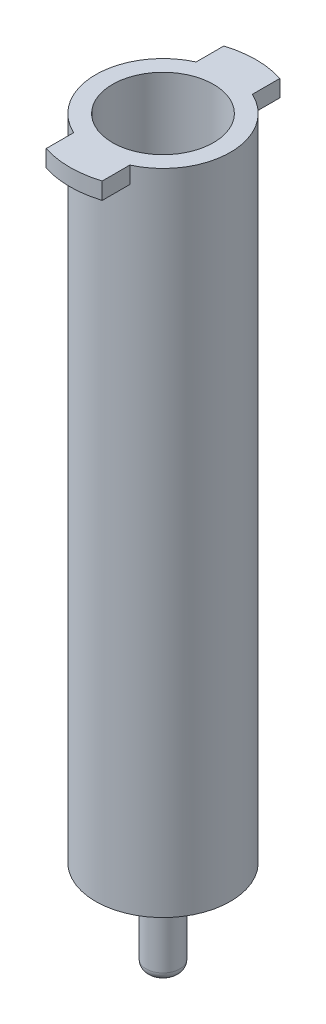
ISO-10303-21;
HEADER;
FILE_DESCRIPTION(('STEP AP214'),'2;1');
FILE_NAME('part.step','',(''),(''),'','','');
FILE_SCHEMA(('AUTOMOTIVE_DESIGN { 1 0 10303 214 1 1 1 1 }'));
ENDSEC;
DATA;
#1=APPLICATION_CONTEXT('core data for automotive mechanical design processes');
#2=APPLICATION_PROTOCOL_DEFINITION('international standard','automotive_design',2000,#1);
#3=PRODUCT_CONTEXT('',#1,'mechanical');
#4=PRODUCT('Part','Part','',(#3));
#5=PRODUCT_RELATED_PRODUCT_CATEGORY('part','',(#4));
#6=PRODUCT_DEFINITION_FORMATION('','',#4);
#7=PRODUCT_DEFINITION_CONTEXT('part definition',#1,'design');
#8=PRODUCT_DEFINITION('design','',#6,#7);
#9=PRODUCT_DEFINITION_SHAPE('','',#8);
#10=(LENGTH_UNIT() NAMED_UNIT(*) SI_UNIT(.MILLI.,.METRE.));
#11=(NAMED_UNIT(*) PLANE_ANGLE_UNIT() SI_UNIT($,.RADIAN.));
#12=(NAMED_UNIT(*) SI_UNIT($,.STERADIAN.) SOLID_ANGLE_UNIT());
#13=UNCERTAINTY_MEASURE_WITH_UNIT(LENGTH_MEASURE(1.E-05),#10,'distance_accuracy_value','');
#14=(GEOMETRIC_REPRESENTATION_CONTEXT(3) GLOBAL_UNCERTAINTY_ASSIGNED_CONTEXT((#13)) GLOBAL_UNIT_ASSIGNED_CONTEXT((#10,
#11,#12)) REPRESENTATION_CONTEXT('',''));
#15=CARTESIAN_POINT('',(0.,0.,0.));
#16=DIRECTION('',(0.,0.,1.));
#17=DIRECTION('',(1.,0.,0.));
#18=AXIS2_PLACEMENT_3D('',#15,#16,#17);
#19=CARTESIAN_POINT('',(0.,58.5,0.));
#20=DIRECTION('',(0.,-1.,0.));
#21=DIRECTION('',(0.,0.,-1.));
#22=AXIS2_PLACEMENT_3D('',#19,#20,#21);
#23=CYLINDRICAL_SURFACE('',#22,6.);
#24=CARTESIAN_POINT('',(0.,58.5,0.));
#25=DIRECTION('',(0.,1.,0.));
#26=DIRECTION('',(0.,0.,1.));
#27=AXIS2_PLACEMENT_3D('',#24,#25,#26);
#28=CIRCLE('',#27,6.);
#29=CARTESIAN_POINT('',(-2.5,58.5,-5.45435605731786));
#30=VERTEX_POINT('',#29);
#31=CARTESIAN_POINT('',(-2.5,58.5,5.45435605731786));
#32=VERTEX_POINT('',#31);
#33=EDGE_CURVE('E190',#30,#32,#28,.T.);
#34=ORIENTED_EDGE('',*,*,#33,.F.);
#35=DIRECTION('',(0.,1.,0.));
#36=VECTOR('',#35,1.);
#37=CARTESIAN_POINT('',(-2.5,57.,-5.45435605731786));
#38=LINE('',#37,#36);
#39=CARTESIAN_POINT('',(-2.5,57.,-5.45435605731786));
#40=VERTEX_POINT('',#39);
#41=EDGE_CURVE('E130',#40,#30,#38,.T.);
#42=ORIENTED_EDGE('',*,*,#41,.F.);
#43=CARTESIAN_POINT('',(0.,57.,0.));
#44=DIRECTION('',(0.,-1.,0.));
#45=DIRECTION('',(0.,0.,-1.));
#46=AXIS2_PLACEMENT_3D('',#43,#44,#45);
#47=CIRCLE('',#46,6.);
#48=CARTESIAN_POINT('',(2.5,57.,-5.45435605731786));
#49=VERTEX_POINT('',#48);
#50=EDGE_CURVE('E122',#40,#49,#47,.T.);
#51=ORIENTED_EDGE('',*,*,#50,.T.);
#52=DIRECTION('',(0.,1.,0.));
#53=VECTOR('',#52,1.);
#54=CARTESIAN_POINT('',(2.5,57.,-5.45435605731786));
#55=LINE('',#54,#53);
#56=CARTESIAN_POINT('',(2.5,58.5,-5.45435605731786));
#57=VERTEX_POINT('',#56);
#58=EDGE_CURVE('E106',#49,#57,#55,.T.);
#59=ORIENTED_EDGE('',*,*,#58,.T.);
#60=CARTESIAN_POINT('',(2.5,58.5,5.45435605731786));
#61=VERTEX_POINT('',#60);
#62=EDGE_CURVE('E181',#61,#57,#28,.T.);
#63=ORIENTED_EDGE('',*,*,#62,.F.);
#64=DIRECTION('',(0.,1.,0.));
#65=VECTOR('',#64,1.);
#66=CARTESIAN_POINT('',(2.5,57.,5.45435605731786));
#67=LINE('',#66,#65);
#68=CARTESIAN_POINT('',(2.5,57.,5.45435605731786));
#69=VERTEX_POINT('',#68);
#70=EDGE_CURVE('E162',#69,#61,#67,.T.);
#71=ORIENTED_EDGE('',*,*,#70,.F.);
#72=CARTESIAN_POINT('',(0.,57.,0.));
#73=DIRECTION('',(0.,-1.,0.));
#74=DIRECTION('',(0.,0.,1.));
#75=AXIS2_PLACEMENT_3D('',#72,#73,#74);
#76=CIRCLE('',#75,6.);
#77=CARTESIAN_POINT('',(-2.5,57.,5.45435605731786));
#78=VERTEX_POINT('',#77);
#79=EDGE_CURVE('E144',#69,#78,#76,.T.);
#80=ORIENTED_EDGE('',*,*,#79,.T.);
#81=DIRECTION('',(0.,1.,0.));
#82=VECTOR('',#81,1.);
#83=CARTESIAN_POINT('',(-2.5,57.,5.45435605731786));
#84=LINE('',#83,#82);
#85=EDGE_CURVE('E156',#78,#32,#84,.T.);
#86=ORIENTED_EDGE('',*,*,#85,.T.);
#87=EDGE_LOOP('',(#34,#42,#51,#59,#63,#71,#80,#86));
#88=FACE_BOUND('',#87,.T.);
#89=CARTESIAN_POINT('',(0.,0.702704173511995,0.));
#90=DIRECTION('',(0.,1.,0.));
#91=DIRECTION('',(0.,0.,1.));
#92=AXIS2_PLACEMENT_3D('',#89,#90,#91);
#93=CIRCLE('',#92,6.);
#94=CARTESIAN_POINT('',(0.,0.702704173511995,6.));
#95=VERTEX_POINT('',#94);
#96=EDGE_CURVE('E47',#95,#95,#93,.T.);
#97=ORIENTED_EDGE('',*,*,#96,.T.);
#98=EDGE_LOOP('',(#97));
#99=FACE_BOUND('',#98,.T.);
#100=ADVANCED_FACE('F38',(#88,#99),#23,.T.);
#101=CARTESIAN_POINT('',(0.,58.5,0.));
#102=DIRECTION('',(0.,1.,0.));
#103=DIRECTION('',(0.,0.,1.));
#104=AXIS2_PLACEMENT_3D('',#101,#102,#103);
#105=PLANE('',#104);
#106=CARTESIAN_POINT('',(0.,58.5,0.));
#107=DIRECTION('',(0.,1.,0.));
#108=DIRECTION('',(0.,0.,1.));
#109=AXIS2_PLACEMENT_3D('',#106,#107,#108);
#110=CIRCLE('',#109,4.5);
#111=CARTESIAN_POINT('',(0.,58.5,4.5));
#112=VERTEX_POINT('',#111);
#113=EDGE_CURVE('E187',#112,#112,#110,.T.);
#114=ORIENTED_EDGE('',*,*,#113,.F.);
#115=EDGE_LOOP('',(#114));
#116=FACE_BOUND('',#115,.T.);
#117=ORIENTED_EDGE('',*,*,#62,.T.);
#118=DIRECTION('',(0.,0.,-1.));
#119=VECTOR('',#118,1.);
#120=CARTESIAN_POINT('',(2.5,58.5,-5.45435605731786));
#121=LINE('',#120,#119);
#122=CARTESIAN_POINT('',(2.5,58.5,-7.91454357496375));
#123=VERTEX_POINT('',#122);
#124=EDGE_CURVE('E111',#57,#123,#121,.T.);
#125=ORIENTED_EDGE('',*,*,#124,.T.);
#126=CARTESIAN_POINT('',(0.,58.5,0.));
#127=DIRECTION('',(0.,1.,0.));
#128=DIRECTION('',(0.,0.,1.));
#129=AXIS2_PLACEMENT_3D('',#126,#127,#128);
#130=CIRCLE('',#129,8.3);
#131=CARTESIAN_POINT('',(-2.5,58.5,-7.91454357496375));
#132=VERTEX_POINT('',#131);
#133=EDGE_CURVE('E132',#123,#132,#130,.T.);
#134=ORIENTED_EDGE('',*,*,#133,.T.);
#135=DIRECTION('',(0.,0.,1.));
#136=VECTOR('',#135,1.);
#137=CARTESIAN_POINT('',(-2.5,58.5,-5.45435605731786));
#138=LINE('',#137,#136);
#139=EDGE_CURVE('E54',#132,#30,#138,.T.);
#140=ORIENTED_EDGE('',*,*,#139,.T.);
#141=ORIENTED_EDGE('',*,*,#33,.T.);
#142=DIRECTION('',(0.,0.,1.));
#143=VECTOR('',#142,1.);
#144=CARTESIAN_POINT('',(-2.5,58.5,5.45435605731786));
#145=LINE('',#144,#143);
#146=CARTESIAN_POINT('',(-2.5,58.5,7.91454357496375));
#147=VERTEX_POINT('',#146);
#148=EDGE_CURVE('E140',#32,#147,#145,.T.);
#149=ORIENTED_EDGE('',*,*,#148,.T.);
#150=CARTESIAN_POINT('',(0.,58.5,0.));
#151=DIRECTION('',(0.,1.,0.));
#152=DIRECTION('',(0.,0.,-1.));
#153=AXIS2_PLACEMENT_3D('',#150,#151,#152);
#154=CIRCLE('',#153,8.3);
#155=CARTESIAN_POINT('',(2.5,58.5,7.91454357496375));
#156=VERTEX_POINT('',#155);
#157=EDGE_CURVE('E159',#147,#156,#154,.T.);
#158=ORIENTED_EDGE('',*,*,#157,.T.);
#159=DIRECTION('',(0.,0.,-1.));
#160=VECTOR('',#159,1.);
#161=CARTESIAN_POINT('',(2.5,58.5,5.45435605731786));
#162=LINE('',#161,#160);
#163=EDGE_CURVE('E61',#156,#61,#162,.T.);
#164=ORIENTED_EDGE('',*,*,#163,.T.);
#165=EDGE_LOOP('',(#117,#125,#134,#140,#141,#149,#158,#164));
#166=FACE_BOUND('',#165,.T.);
#167=ADVANCED_FACE('F214',(#116,#166),#105,.T.);
#168=CARTESIAN_POINT('',(0.,58.5,0.));
#169=DIRECTION('',(0.,-1.,0.));
#170=DIRECTION('',(0.,0.,-1.));
#171=AXIS2_PLACEMENT_3D('',#168,#169,#170);
#172=CYLINDRICAL_SURFACE('',#171,4.5);
#173=ORIENTED_EDGE('',*,*,#113,.T.);
#174=EDGE_LOOP('',(#173));
#175=FACE_BOUND('',#174,.T.);
#176=CARTESIAN_POINT('',(0.,1.5,0.));
#177=DIRECTION('',(0.,1.,0.));
#178=DIRECTION('',(0.,0.,1.));
#179=AXIS2_PLACEMENT_3D('',#176,#177,#178);
#180=CIRCLE('',#179,4.5);
#181=CARTESIAN_POINT('',(0.,1.5,4.5));
#182=VERTEX_POINT('',#181);
#183=EDGE_CURVE('E184',#182,#182,#180,.T.);
#184=ORIENTED_EDGE('',*,*,#183,.F.);
#185=EDGE_LOOP('',(#184));
#186=FACE_BOUND('',#185,.T.);
#187=ADVANCED_FACE('F219',(#175,#186),#172,.F.);
#188=CARTESIAN_POINT('',(0.,1.5,0.));
#189=DIRECTION('',(0.,1.,0.));
#190=DIRECTION('',(0.,0.,1.));
#191=AXIS2_PLACEMENT_3D('',#188,#189,#190);
#192=PLANE('',#191);
#193=CARTESIAN_POINT('',(0.,1.5,0.));
#194=DIRECTION('',(0.,1.,0.));
#195=DIRECTION('',(0.,0.,1.));
#196=AXIS2_PLACEMENT_3D('',#193,#194,#195);
#197=CIRCLE('',#196,0.7);
#198=CARTESIAN_POINT('',(0.,1.5,0.7));
#199=VERTEX_POINT('',#198);
#200=EDGE_CURVE('E173',#199,#199,#197,.T.);
#201=ORIENTED_EDGE('',*,*,#200,.F.);
#202=EDGE_LOOP('',(#201));
#203=FACE_BOUND('',#202,.T.);
#204=ORIENTED_EDGE('',*,*,#183,.T.);
#205=EDGE_LOOP('',(#204));
#206=FACE_BOUND('',#205,.T.);
#207=ADVANCED_FACE('F223',(#203,#206),#192,.T.);
#208=CARTESIAN_POINT('',(0.,-1.3,0.));
#209=DIRECTION('',(0.,1.,0.));
#210=DIRECTION('',(0.,0.,1.));
#211=AXIS2_PLACEMENT_3D('',#208,#209,#210);
#212=CYLINDRICAL_SURFACE('',#211,2.5);
#213=CARTESIAN_POINT('',(0.,0.210811252053599,0.));
#214=DIRECTION('',(0.,1.,0.));
#215=DIRECTION('',(0.,0.,1.));
#216=AXIS2_PLACEMENT_3D('',#213,#214,#215);
#217=CIRCLE('',#216,2.5);
#218=CARTESIAN_POINT('',(0.,0.210811252053599,2.5));
#219=VERTEX_POINT('',#218);
#220=EDGE_CURVE('E11',#219,#219,#217,.F.);
#221=ORIENTED_EDGE('',*,*,#220,.T.);
#222=EDGE_LOOP('',(#221));
#223=FACE_BOUND('',#222,.T.);
#224=CARTESIAN_POINT('',(0.,-1.3,0.));
#225=DIRECTION('',(0.,-1.,0.));
#226=DIRECTION('',(0.,0.,-1.));
#227=AXIS2_PLACEMENT_3D('',#224,#225,#226);
#228=CIRCLE('',#227,2.5);
#229=CARTESIAN_POINT('',(0.,-1.3,-2.5));
#230=VERTEX_POINT('',#229);
#231=EDGE_CURVE('E176',#230,#230,#228,.T.);
#232=ORIENTED_EDGE('',*,*,#231,.F.);
#233=EDGE_LOOP('',(#232));
#234=FACE_BOUND('',#233,.T.);
#235=ADVANCED_FACE('F226',(#223,#234),#212,.T.);
#236=CARTESIAN_POINT('',(0.,-1.3,0.));
#237=DIRECTION('',(0.,-1.,0.));
#238=DIRECTION('',(0.,0.,-1.));
#239=AXIS2_PLACEMENT_3D('',#236,#237,#238);
#240=PLANE('',#239);
#241=CARTESIAN_POINT('',(0.,-1.3,0.));
#242=DIRECTION('',(0.,-1.,0.));
#243=DIRECTION('',(0.,0.,-1.));
#244=AXIS2_PLACEMENT_3D('',#241,#242,#243);
#245=CIRCLE('',#244,1.5);
#246=CARTESIAN_POINT('',(0.,-1.3,1.5));
#247=VERTEX_POINT('',#246);
#248=EDGE_CURVE('E177',#247,#247,#245,.T.);
#249=ORIENTED_EDGE('',*,*,#248,.F.);
#250=EDGE_LOOP('',(#249));
#251=FACE_BOUND('',#250,.T.);
#252=ORIENTED_EDGE('',*,*,#231,.T.);
#253=EDGE_LOOP('',(#252));
#254=FACE_BOUND('',#253,.T.);
#255=ADVANCED_FACE('F233',(#251,#254),#240,.T.);
#256=CARTESIAN_POINT('',(0.,-7.5,0.));
#257=DIRECTION('',(0.,1.,0.));
#258=DIRECTION('',(0.,0.,1.));
#259=AXIS2_PLACEMENT_3D('',#256,#257,#258);
#260=CYLINDRICAL_SURFACE('',#259,1.5);
#261=CARTESIAN_POINT('',(0.,-6.75,0.));
#262=DIRECTION('',(0.,-1.,0.));
#263=DIRECTION('',(0.,0.,-1.));
#264=AXIS2_PLACEMENT_3D('',#261,#262,#263);
#265=CIRCLE('',#264,1.5);
#266=CARTESIAN_POINT('',(0.,-6.75,1.5));
#267=VERTEX_POINT('',#266);
#268=EDGE_CURVE('E194',#267,#267,#265,.F.);
#269=CARTESIAN_POINT('',(0.,-6.75,1.5));
#270=CARTESIAN_POINT('',(0.,-6.69322916666667,1.5));
#271=CARTESIAN_POINT('',(0.,-6.63645833333333,1.5));
#272=CARTESIAN_POINT('',(0.,-6.52291666666667,1.5));
#273=CARTESIAN_POINT('',(0.,-6.46614583333333,1.5));
#274=CARTESIAN_POINT('',(0.,-6.35260416666667,1.5));
#275=CARTESIAN_POINT('',(0.,-6.29583333333333,1.5));
#276=CARTESIAN_POINT('',(0.,-6.18229166666667,1.5));
#277=CARTESIAN_POINT('',(0.,-6.12552083333333,1.5));
#278=CARTESIAN_POINT('',(0.,-6.01197916666667,1.5));
#279=CARTESIAN_POINT('',(0.,-5.95520833333333,1.5));
#280=CARTESIAN_POINT('',(0.,-5.84166666666667,1.5));
#281=CARTESIAN_POINT('',(0.,-5.78489583333333,1.5));
#282=CARTESIAN_POINT('',(0.,-5.67135416666667,1.5));
#283=CARTESIAN_POINT('',(0.,-5.61458333333333,1.5));
#284=CARTESIAN_POINT('',(0.,-5.50104166666667,1.5));
#285=CARTESIAN_POINT('',(0.,-5.44427083333333,1.5));
#286=CARTESIAN_POINT('',(0.,-5.33072916666667,1.5));
#287=CARTESIAN_POINT('',(0.,-5.27395833333333,1.5));
#288=CARTESIAN_POINT('',(0.,-5.16041666666667,1.5));
#289=CARTESIAN_POINT('',(0.,-5.10364583333333,1.5));
#290=CARTESIAN_POINT('',(0.,-4.99010416666667,1.5));
#291=CARTESIAN_POINT('',(0.,-4.93333333333333,1.5));
#292=CARTESIAN_POINT('',(0.,-4.81979166666667,1.5));
#293=CARTESIAN_POINT('',(0.,-4.76302083333333,1.5));
#294=CARTESIAN_POINT('',(0.,-4.64947916666667,1.5));
#295=CARTESIAN_POINT('',(0.,-4.59270833333333,1.5));
#296=CARTESIAN_POINT('',(0.,-4.47916666666667,1.5));
#297=CARTESIAN_POINT('',(0.,-4.42239583333333,1.5));
#298=CARTESIAN_POINT('',(0.,-4.30885416666667,1.5));
#299=CARTESIAN_POINT('',(0.,-4.25208333333333,1.5));
#300=CARTESIAN_POINT('',(0.,-4.13854166666667,1.5));
#301=CARTESIAN_POINT('',(0.,-4.08177083333333,1.5));
#302=CARTESIAN_POINT('',(0.,-3.96822916666667,1.5));
#303=CARTESIAN_POINT('',(0.,-3.91145833333333,1.5));
#304=CARTESIAN_POINT('',(0.,-3.79791666666667,1.5));
#305=CARTESIAN_POINT('',(0.,-3.74114583333333,1.5));
#306=CARTESIAN_POINT('',(0.,-3.62760416666667,1.5));
#307=CARTESIAN_POINT('',(0.,-3.57083333333333,1.5));
#308=CARTESIAN_POINT('',(0.,-3.45729166666667,1.5));
#309=CARTESIAN_POINT('',(0.,-3.40052083333333,1.5));
#310=CARTESIAN_POINT('',(0.,-3.28697916666667,1.5));
#311=CARTESIAN_POINT('',(0.,-3.23020833333333,1.5));
#312=CARTESIAN_POINT('',(0.,-3.11666666666667,1.5));
#313=CARTESIAN_POINT('',(0.,-3.05989583333333,1.5));
#314=CARTESIAN_POINT('',(0.,-2.94635416666667,1.5));
#315=CARTESIAN_POINT('',(0.,-2.88958333333333,1.5));
#316=CARTESIAN_POINT('',(0.,-2.77604166666667,1.5));
#317=CARTESIAN_POINT('',(0.,-2.71927083333333,1.5));
#318=CARTESIAN_POINT('',(0.,-2.60572916666667,1.5));
#319=CARTESIAN_POINT('',(0.,-2.54895833333333,1.5));
#320=CARTESIAN_POINT('',(0.,-2.43541666666667,1.5));
#321=CARTESIAN_POINT('',(0.,-2.37864583333333,1.5));
#322=CARTESIAN_POINT('',(0.,-2.26510416666667,1.5));
#323=CARTESIAN_POINT('',(0.,-2.20833333333333,1.5));
#324=CARTESIAN_POINT('',(0.,-2.09479166666667,1.5));
#325=CARTESIAN_POINT('',(0.,-2.03802083333333,1.5));
#326=CARTESIAN_POINT('',(0.,-1.92447916666667,1.5));
#327=CARTESIAN_POINT('',(0.,-1.86770833333333,1.5));
#328=CARTESIAN_POINT('',(0.,-1.75416666666667,1.5));
#329=CARTESIAN_POINT('',(0.,-1.69739583333333,1.5));
#330=CARTESIAN_POINT('',(0.,-1.58385416666667,1.5));
#331=CARTESIAN_POINT('',(0.,-1.52708333333333,1.5));
#332=CARTESIAN_POINT('',(0.,-1.41354166666667,1.5));
#333=CARTESIAN_POINT('',(0.,-1.35677083333333,1.5));
#334=CARTESIAN_POINT('',(0.,-1.3,1.5));
#335=B_SPLINE_CURVE_WITH_KNOTS('',3,(#269,#270,#271,#272,#273,#274,#275,#276,#277,#278,#279,
#280,#281,#282,#283,#284,#285,#286,#287,#288,#289,#290,#291,#292,#293,#294,#295,#296,#297,#298,
#299,#300,#301,#302,#303,#304,#305,#306,#307,#308,#309,#310,#311,#312,#313,#314,#315,#316,#317,
#318,#319,#320,#321,#322,#323,#324,#325,#326,#327,#328,#329,#330,#331,#332,#333,#334),
.UNSPECIFIED.,.F.,.F.,(4,2,2,2,2,2,2,2,2,2,2,2,2,2,2,2,2,2,2,2,2,2,2,2,2,2,2,2,2,2,2,2,4),(0.,
0.1703125,0.340625,0.5109375,0.68125,0.8515625,1.021875,1.1921875,1.3625,1.5328125,1.703125,
1.8734375,2.04375,2.2140625,2.384375,2.5546875,2.725,2.8953125,3.065625,3.2359375,3.40625,
3.5765625,3.746875,3.9171875,4.0875,4.2578125,4.428125,4.5984375,4.76875,4.9390625,5.109375,
5.2796875,5.45),.UNSPECIFIED.);
#336=EDGE_CURVE('BSEAM237',#267,#247,#335,.T.);
#337=ORIENTED_EDGE('',*,*,#268,.T.);
#338=ORIENTED_EDGE('',*,*,#248,.T.);
#339=ORIENTED_EDGE('',*,*,#336,.T.);
#340=ORIENTED_EDGE('',*,*,#336,.F.);
#341=EDGE_LOOP('',(#337,#339,#338,#340));
#342=FACE_BOUND('',#341,.T.);
#343=ADVANCED_FACE('F237',(#342),#260,.T.);
#344=CARTESIAN_POINT('',(0.,-7.5,0.));
#345=DIRECTION('',(0.,-1.,0.));
#346=DIRECTION('',(0.,0.,-1.));
#347=AXIS2_PLACEMENT_3D('',#344,#345,#346);
#348=PLANE('',#347);
#349=CARTESIAN_POINT('',(0.,-7.5,0.));
#350=DIRECTION('',(0.,-1.,0.));
#351=DIRECTION('',(0.,0.,-1.));
#352=AXIS2_PLACEMENT_3D('',#349,#350,#351);
#353=CIRCLE('',#352,0.75);
#354=CARTESIAN_POINT('',(0.,-7.5,-0.75));
#355=VERTEX_POINT('',#354);
#356=EDGE_CURVE('E180',#355,#355,#353,.T.);
#357=ORIENTED_EDGE('',*,*,#356,.T.);
#358=EDGE_LOOP('',(#357));
#359=FACE_BOUND('',#358,.T.);
#360=CARTESIAN_POINT('',(0.,-7.5,0.));
#361=DIRECTION('',(0.,-1.,0.));
#362=DIRECTION('',(0.,0.,-1.));
#363=AXIS2_PLACEMENT_3D('',#360,#361,#362);
#364=CIRCLE('',#363,0.7);
#365=CARTESIAN_POINT('',(0.,-7.5,-0.7));
#366=VERTEX_POINT('',#365);
#367=EDGE_CURVE('E164',#366,#366,#364,.T.);
#368=ORIENTED_EDGE('',*,*,#367,.F.);
#369=EDGE_LOOP('',(#368));
#370=FACE_BOUND('',#369,.T.);
#371=ADVANCED_FACE('F241',(#359,#370),#348,.T.);
#372=CARTESIAN_POINT('',(0.,58.5,0.));
#373=DIRECTION('',(0.,-1.,0.));
#374=DIRECTION('',(0.,0.,-1.));
#375=AXIS2_PLACEMENT_3D('',#372,#373,#374);
#376=CYLINDRICAL_SURFACE('',#375,0.7);
#377=ORIENTED_EDGE('',*,*,#200,.T.);
#378=EDGE_LOOP('',(#377));
#379=FACE_BOUND('',#378,.T.);
#380=ORIENTED_EDGE('',*,*,#367,.T.);
#381=EDGE_LOOP('',(#380));
#382=FACE_BOUND('',#381,.T.);
#383=ADVANCED_FACE('F210',(#379,#382),#376,.F.);
#384=CARTESIAN_POINT('',(0.,-6.75,0.));
#385=DIRECTION('',(0.,-1.,0.));
#386=DIRECTION('',(0.,0.,-1.));
#387=AXIS2_PLACEMENT_3D('',#384,#385,#386);
#388=TOROIDAL_SURFACE('',#387,0.75,0.75);
#389=ORIENTED_EDGE('',*,*,#268,.F.);
#390=EDGE_LOOP('',(#389));
#391=FACE_BOUND('',#390,.T.);
#392=ORIENTED_EDGE('',*,*,#356,.F.);
#393=EDGE_LOOP('',(#392));
#394=FACE_BOUND('',#393,.T.);
#395=ADVANCED_FACE('F201',(#391,#394),#388,.T.);
#396=CARTESIAN_POINT('',(0.,0.702704173511995,0.));
#397=DIRECTION('',(0.,1.,0.));
#398=DIRECTION('',(0.,0.,1.));
#399=AXIS2_PLACEMENT_3D('',#396,#397,#398);
#400=CONICAL_SURFACE('',#399,6.,1.43116998663534);
#401=ORIENTED_EDGE('',*,*,#220,.F.);
#402=EDGE_LOOP('',(#401));
#403=FACE_BOUND('',#402,.T.);
#404=ORIENTED_EDGE('',*,*,#96,.F.);
#405=EDGE_LOOP('',(#404));
#406=FACE_BOUND('',#405,.T.);
#407=ADVANCED_FACE('F41',(#403,#406),#400,.T.);
#408=CARTESIAN_POINT('',(2.5,57.,5.45435605731786));
#409=DIRECTION('',(1.,0.,0.));
#410=DIRECTION('',(0.,0.,-1.));
#411=AXIS2_PLACEMENT_3D('',#408,#409,#410);
#412=PLANE('',#411);
#413=ORIENTED_EDGE('',*,*,#163,.F.);
#414=DIRECTION('',(0.,1.,0.));
#415=VECTOR('',#414,1.);
#416=CARTESIAN_POINT('',(2.5,57.,7.91454357496375));
#417=LINE('',#416,#415);
#418=CARTESIAN_POINT('',(2.5,57.,7.91454357496375));
#419=VERTEX_POINT('',#418);
#420=EDGE_CURVE('E165',#419,#156,#417,.T.);
#421=ORIENTED_EDGE('',*,*,#420,.F.);
#422=DIRECTION('',(0.,0.,-1.));
#423=VECTOR('',#422,1.);
#424=CARTESIAN_POINT('',(2.5,57.,5.45435605731786));
#425=LINE('',#424,#423);
#426=EDGE_CURVE('E153',#419,#69,#425,.T.);
#427=ORIENTED_EDGE('',*,*,#426,.T.);
#428=ORIENTED_EDGE('',*,*,#70,.T.);
#429=EDGE_LOOP('',(#413,#421,#427,#428));
#430=FACE_BOUND('',#429,.T.);
#431=ADVANCED_FACE('F200',(#430),#412,.T.);
#432=CARTESIAN_POINT('',(0.,57.,0.));
#433=DIRECTION('',(0.,1.,0.));
#434=DIRECTION('',(0.,0.,1.));
#435=AXIS2_PLACEMENT_3D('',#432,#433,#434);
#436=CYLINDRICAL_SURFACE('',#435,8.3);
#437=ORIENTED_EDGE('',*,*,#157,.F.);
#438=DIRECTION('',(0.,1.,0.));
#439=VECTOR('',#438,1.);
#440=CARTESIAN_POINT('',(-2.5,57.,7.91454357496375));
#441=LINE('',#440,#439);
#442=CARTESIAN_POINT('',(-2.5,57.,7.91454357496375));
#443=VERTEX_POINT('',#442);
#444=EDGE_CURVE('E167',#443,#147,#441,.T.);
#445=ORIENTED_EDGE('',*,*,#444,.F.);
#446=CARTESIAN_POINT('',(0.,57.,0.));
#447=DIRECTION('',(0.,1.,0.));
#448=DIRECTION('',(0.,0.,-1.));
#449=AXIS2_PLACEMENT_3D('',#446,#447,#448);
#450=CIRCLE('',#449,8.3);
#451=EDGE_CURVE('E150',#443,#419,#450,.T.);
#452=ORIENTED_EDGE('',*,*,#451,.T.);
#453=ORIENTED_EDGE('',*,*,#420,.T.);
#454=EDGE_LOOP('',(#437,#445,#452,#453));
#455=FACE_BOUND('',#454,.T.);
#456=ADVANCED_FACE('F207',(#455),#436,.T.);
#457=CARTESIAN_POINT('',(-2.5,57.,5.45435605731786));
#458=DIRECTION('',(-1.,0.,0.));
#459=DIRECTION('',(0.,0.,1.));
#460=AXIS2_PLACEMENT_3D('',#457,#458,#459);
#461=PLANE('',#460);
#462=ORIENTED_EDGE('',*,*,#148,.F.);
#463=ORIENTED_EDGE('',*,*,#85,.F.);
#464=DIRECTION('',(0.,0.,1.));
#465=VECTOR('',#464,1.);
#466=CARTESIAN_POINT('',(-2.5,57.,5.45435605731786));
#467=LINE('',#466,#465);
#468=EDGE_CURVE('E147',#78,#443,#467,.T.);
#469=ORIENTED_EDGE('',*,*,#468,.T.);
#470=ORIENTED_EDGE('',*,*,#444,.T.);
#471=EDGE_LOOP('',(#462,#463,#469,#470));
#472=FACE_BOUND('',#471,.T.);
#473=ADVANCED_FACE('F249',(#472),#461,.T.);
#474=CARTESIAN_POINT('',(0.,57.,0.));
#475=DIRECTION('',(0.,1.,0.));
#476=DIRECTION('',(0.,0.,1.));
#477=AXIS2_PLACEMENT_3D('',#474,#475,#476);
#478=PLANE('',#477);
#479=ORIENTED_EDGE('',*,*,#79,.F.);
#480=ORIENTED_EDGE('',*,*,#426,.F.);
#481=ORIENTED_EDGE('',*,*,#451,.F.);
#482=ORIENTED_EDGE('',*,*,#468,.F.);
#483=EDGE_LOOP('',(#479,#480,#481,#482));
#484=FACE_BOUND('',#483,.T.);
#485=ADVANCED_FACE('F252',(#484),#478,.F.);
#486=CARTESIAN_POINT('',(-2.5,57.,-5.45435605731786));
#487=DIRECTION('',(-1.,0.,0.));
#488=DIRECTION('',(0.,0.,1.));
#489=AXIS2_PLACEMENT_3D('',#486,#487,#488);
#490=PLANE('',#489);
#491=ORIENTED_EDGE('',*,*,#139,.F.);
#492=DIRECTION('',(0.,1.,0.));
#493=VECTOR('',#492,1.);
#494=CARTESIAN_POINT('',(-2.5,57.,-7.91454357496375));
#495=LINE('',#494,#493);
#496=CARTESIAN_POINT('',(-2.5,57.,-7.91454357496375));
#497=VERTEX_POINT('',#496);
#498=EDGE_CURVE('E141',#497,#132,#495,.T.);
#499=ORIENTED_EDGE('',*,*,#498,.F.);
#500=DIRECTION('',(0.,0.,1.));
#501=VECTOR('',#500,1.);
#502=CARTESIAN_POINT('',(-2.5,57.,-5.45435605731786));
#503=LINE('',#502,#501);
#504=EDGE_CURVE('E116',#497,#40,#503,.T.);
#505=ORIENTED_EDGE('',*,*,#504,.T.);
#506=ORIENTED_EDGE('',*,*,#41,.T.);
#507=EDGE_LOOP('',(#491,#499,#505,#506));
#508=FACE_BOUND('',#507,.T.);
#509=ADVANCED_FACE('F259',(#508),#490,.T.);
#510=CARTESIAN_POINT('',(0.,57.,0.));
#511=DIRECTION('',(0.,1.,0.));
#512=DIRECTION('',(0.,0.,1.));
#513=AXIS2_PLACEMENT_3D('',#510,#511,#512);
#514=CYLINDRICAL_SURFACE('',#513,8.3);
#515=ORIENTED_EDGE('',*,*,#133,.F.);
#516=DIRECTION('',(0.,1.,0.));
#517=VECTOR('',#516,1.);
#518=CARTESIAN_POINT('',(2.5,57.,-7.91454357496375));
#519=LINE('',#518,#517);
#520=CARTESIAN_POINT('',(2.5,57.,-7.91454357496375));
#521=VERTEX_POINT('',#520);
#522=EDGE_CURVE('E115',#521,#123,#519,.T.);
#523=ORIENTED_EDGE('',*,*,#522,.F.);
#524=CARTESIAN_POINT('',(0.,57.,0.));
#525=DIRECTION('',(0.,1.,0.));
#526=DIRECTION('',(0.,0.,1.));
#527=AXIS2_PLACEMENT_3D('',#524,#525,#526);
#528=CIRCLE('',#527,8.3);
#529=EDGE_CURVE('E125',#521,#497,#528,.T.);
#530=ORIENTED_EDGE('',*,*,#529,.T.);
#531=ORIENTED_EDGE('',*,*,#498,.T.);
#532=EDGE_LOOP('',(#515,#523,#530,#531));
#533=FACE_BOUND('',#532,.T.);
#534=ADVANCED_FACE('F263',(#533),#514,.T.);
#535=CARTESIAN_POINT('',(2.5,57.,-5.45435605731786));
#536=DIRECTION('',(1.,0.,0.));
#537=DIRECTION('',(0.,0.,-1.));
#538=AXIS2_PLACEMENT_3D('',#535,#536,#537);
#539=PLANE('',#538);
#540=ORIENTED_EDGE('',*,*,#124,.F.);
#541=ORIENTED_EDGE('',*,*,#58,.F.);
#542=DIRECTION('',(0.,0.,-1.));
#543=VECTOR('',#542,1.);
#544=CARTESIAN_POINT('',(2.5,57.,-5.45435605731786));
#545=LINE('',#544,#543);
#546=EDGE_CURVE('E109',#49,#521,#545,.T.);
#547=ORIENTED_EDGE('',*,*,#546,.T.);
#548=ORIENTED_EDGE('',*,*,#522,.T.);
#549=EDGE_LOOP('',(#540,#541,#547,#548));
#550=FACE_BOUND('',#549,.T.);
#551=ADVANCED_FACE('F108',(#550),#539,.T.);
#552=CARTESIAN_POINT('',(0.,57.,0.));
#553=DIRECTION('',(0.,-1.,0.));
#554=DIRECTION('',(0.,0.,-1.));
#555=AXIS2_PLACEMENT_3D('',#552,#553,#554);
#556=PLANE('',#555);
#557=ORIENTED_EDGE('',*,*,#50,.F.);
#558=ORIENTED_EDGE('',*,*,#504,.F.);
#559=ORIENTED_EDGE('',*,*,#529,.F.);
#560=ORIENTED_EDGE('',*,*,#546,.F.);
#561=EDGE_LOOP('',(#557,#558,#559,#560));
#562=FACE_BOUND('',#561,.T.);
#563=ADVANCED_FACE('F120',(#562),#556,.T.);
#564=CLOSED_SHELL('',(#100,#167,#187,#207,#235,#255,#343,#371,#383,#395,#407,#431,#456,#473,
#485,#509,#534,#551,#563));
#565=MANIFOLD_SOLID_BREP('B2',#564);
#566=ADVANCED_BREP_SHAPE_REPRESENTATION('',(#18,#565),#14);
#567=SHAPE_DEFINITION_REPRESENTATION(#9,#566);
ENDSEC;
END-ISO-10303-21;
